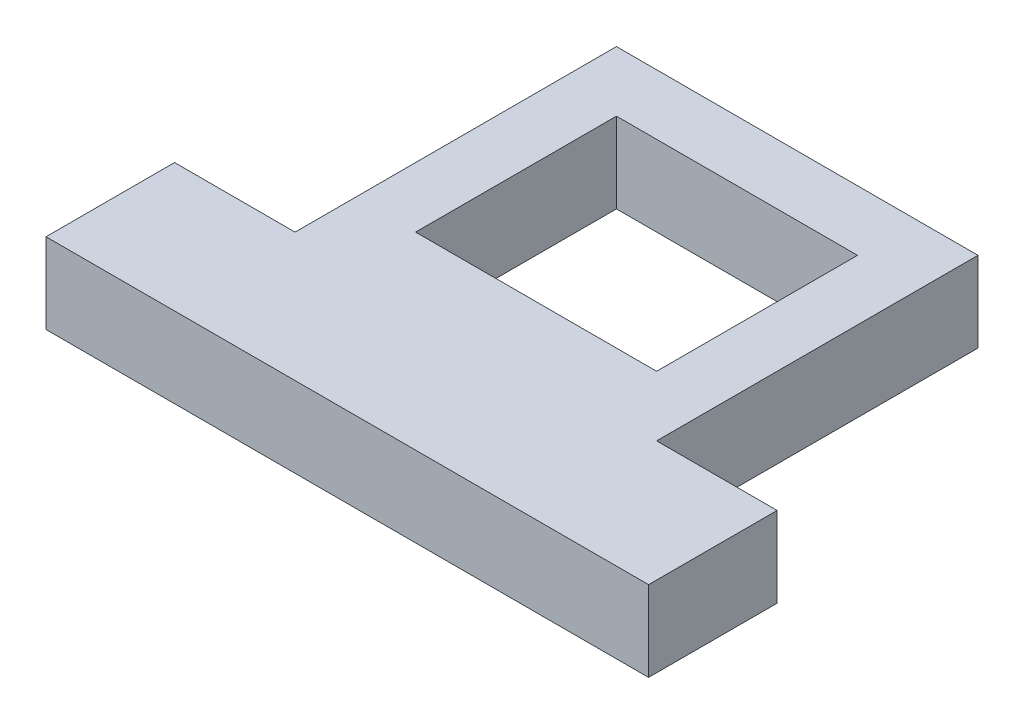
ISO-10303-21;
HEADER;
FILE_DESCRIPTION(('STEP AP214'),'2;1');
FILE_NAME('part.step','',(''),(''),'','','');
FILE_SCHEMA(('AUTOMOTIVE_DESIGN { 1 0 10303 214 1 1 1 1 }'));
ENDSEC;
DATA;
#1=APPLICATION_CONTEXT('core data for automotive mechanical design processes');
#2=APPLICATION_PROTOCOL_DEFINITION('international standard','automotive_design',2000,#1);
#3=PRODUCT_CONTEXT('',#1,'mechanical');
#4=PRODUCT('Part','Part','',(#3));
#5=PRODUCT_RELATED_PRODUCT_CATEGORY('part','',(#4));
#6=PRODUCT_DEFINITION_FORMATION('','',#4);
#7=PRODUCT_DEFINITION_CONTEXT('part definition',#1,'design');
#8=PRODUCT_DEFINITION('design','',#6,#7);
#9=PRODUCT_DEFINITION_SHAPE('','',#8);
#10=(LENGTH_UNIT() NAMED_UNIT(*) SI_UNIT(.MILLI.,.METRE.));
#11=(NAMED_UNIT(*) PLANE_ANGLE_UNIT() SI_UNIT($,.RADIAN.));
#12=(NAMED_UNIT(*) SI_UNIT($,.STERADIAN.) SOLID_ANGLE_UNIT());
#13=UNCERTAINTY_MEASURE_WITH_UNIT(LENGTH_MEASURE(1.E-05),#10,'distance_accuracy_value','');
#14=(GEOMETRIC_REPRESENTATION_CONTEXT(3) GLOBAL_UNCERTAINTY_ASSIGNED_CONTEXT((#13)) GLOBAL_UNIT_ASSIGNED_CONTEXT((#10,
#11,#12)) REPRESENTATION_CONTEXT('',''));
#15=CARTESIAN_POINT('',(0.,0.,0.));
#16=DIRECTION('',(0.,0.,1.));
#17=DIRECTION('',(1.,0.,0.));
#18=AXIS2_PLACEMENT_3D('',#15,#16,#17);
#19=CARTESIAN_POINT('',(0.,2.,0.));
#20=DIRECTION('',(0.,1.,0.));
#21=DIRECTION('',(0.,0.,1.));
#22=AXIS2_PLACEMENT_3D('',#19,#20,#21);
#23=PLANE('',#22);
#24=DIRECTION('',(0.,0.,1.));
#25=VECTOR('',#24,1.);
#26=CARTESIAN_POINT('',(-4.5,2.,-4.));
#27=LINE('',#26,#25);
#28=CARTESIAN_POINT('',(-4.5,2.,-4.));
#29=VERTEX_POINT('',#28);
#30=CARTESIAN_POINT('',(-4.5,2.,4.));
#31=VERTEX_POINT('',#30);
#32=EDGE_CURVE('E205',#29,#31,#27,.T.);
#33=ORIENTED_EDGE('',*,*,#32,.T.);
#34=DIRECTION('',(-1.,0.,0.));
#35=VECTOR('',#34,1.);
#36=CARTESIAN_POINT('',(7.5,2.,4.));
#37=LINE('',#36,#35);
#38=CARTESIAN_POINT('',(-7.5,2.,4.));
#39=VERTEX_POINT('',#38);
#40=EDGE_CURVE('E142',#31,#39,#37,.T.);
#41=ORIENTED_EDGE('',*,*,#40,.T.);
#42=DIRECTION('',(0.,0.,1.));
#43=VECTOR('',#42,1.);
#44=CARTESIAN_POINT('',(-7.5,2.,4.));
#45=LINE('',#44,#43);
#46=CARTESIAN_POINT('',(-7.5,2.,7.2));
#47=VERTEX_POINT('',#46);
#48=EDGE_CURVE('E141',#39,#47,#45,.T.);
#49=ORIENTED_EDGE('',*,*,#48,.T.);
#50=DIRECTION('',(1.,0.,0.));
#51=VECTOR('',#50,1.);
#52=CARTESIAN_POINT('',(7.5,2.,7.2));
#53=LINE('',#52,#51);
#54=CARTESIAN_POINT('',(7.5,2.,7.2));
#55=VERTEX_POINT('',#54);
#56=EDGE_CURVE('E148',#47,#55,#53,.T.);
#57=ORIENTED_EDGE('',*,*,#56,.T.);
#58=DIRECTION('',(0.,0.,-1.));
#59=VECTOR('',#58,1.);
#60=CARTESIAN_POINT('',(7.5,2.,4.));
#61=LINE('',#60,#59);
#62=CARTESIAN_POINT('',(7.5,2.,4.));
#63=VERTEX_POINT('',#62);
#64=EDGE_CURVE('E145',#55,#63,#61,.T.);
#65=ORIENTED_EDGE('',*,*,#64,.T.);
#66=CARTESIAN_POINT('',(4.5,2.,4.));
#67=VERTEX_POINT('',#66);
#68=EDGE_CURVE('E132',#63,#67,#37,.T.);
#69=ORIENTED_EDGE('',*,*,#68,.T.);
#70=DIRECTION('',(0.,0.,-1.));
#71=VECTOR('',#70,1.);
#72=CARTESIAN_POINT('',(4.5,2.,-4.));
#73=LINE('',#72,#71);
#74=CARTESIAN_POINT('',(4.5,2.,-4.));
#75=VERTEX_POINT('',#74);
#76=EDGE_CURVE('E208',#67,#75,#73,.T.);
#77=ORIENTED_EDGE('',*,*,#76,.T.);
#78=DIRECTION('',(-1.,0.,0.));
#79=VECTOR('',#78,1.);
#80=CARTESIAN_POINT('',(-4.5,2.,-4.));
#81=LINE('',#80,#79);
#82=EDGE_CURVE('E212',#75,#29,#81,.T.);
#83=ORIENTED_EDGE('',*,*,#82,.T.);
#84=EDGE_LOOP('',(#33,#41,#49,#57,#65,#69,#77,#83));
#85=FACE_BOUND('',#84,.T.);
#86=DIRECTION('',(-1.,0.,0.));
#87=VECTOR('',#86,1.);
#88=CARTESIAN_POINT('',(-3.,2.,-2.5));
#89=LINE('',#88,#87);
#90=CARTESIAN_POINT('',(3.,2.,-2.5));
#91=VERTEX_POINT('',#90);
#92=CARTESIAN_POINT('',(-3.,2.,-2.5));
#93=VERTEX_POINT('',#92);
#94=EDGE_CURVE('E173',#91,#93,#89,.T.);
#95=ORIENTED_EDGE('',*,*,#94,.F.);
#96=DIRECTION('',(0.,0.,-1.));
#97=VECTOR('',#96,1.);
#98=CARTESIAN_POINT('',(3.,2.,-2.5));
#99=LINE('',#98,#97);
#100=CARTESIAN_POINT('',(3.,2.,2.5));
#101=VERTEX_POINT('',#100);
#102=EDGE_CURVE('E170',#101,#91,#99,.T.);
#103=ORIENTED_EDGE('',*,*,#102,.F.);
#104=DIRECTION('',(1.,0.,0.));
#105=VECTOR('',#104,1.);
#106=CARTESIAN_POINT('',(-3.,2.,2.5));
#107=LINE('',#106,#105);
#108=CARTESIAN_POINT('',(-3.,2.,2.5));
#109=VERTEX_POINT('',#108);
#110=EDGE_CURVE('E180',#109,#101,#107,.T.);
#111=ORIENTED_EDGE('',*,*,#110,.F.);
#112=DIRECTION('',(0.,0.,1.));
#113=VECTOR('',#112,1.);
#114=CARTESIAN_POINT('',(-3.,2.,-2.5));
#115=LINE('',#114,#113);
#116=EDGE_CURVE('E177',#93,#109,#115,.T.);
#117=ORIENTED_EDGE('',*,*,#116,.F.);
#118=EDGE_LOOP('',(#95,#103,#111,#117));
#119=FACE_BOUND('',#118,.T.);
#120=ADVANCED_FACE('F39',(#85,#119),#23,.T.);
#121=CARTESIAN_POINT('',(0.,0.,0.));
#122=DIRECTION('',(0.,1.,0.));
#123=DIRECTION('',(0.,0.,1.));
#124=AXIS2_PLACEMENT_3D('',#121,#122,#123);
#125=PLANE('',#124);
#126=DIRECTION('',(0.,0.,1.));
#127=VECTOR('',#126,1.);
#128=CARTESIAN_POINT('',(-4.5,0.,-4.));
#129=LINE('',#128,#127);
#130=CARTESIAN_POINT('',(-4.5,0.,-4.));
#131=VERTEX_POINT('',#130);
#132=CARTESIAN_POINT('',(-4.5,0.,4.));
#133=VERTEX_POINT('',#132);
#134=EDGE_CURVE('E204',#131,#133,#129,.T.);
#135=ORIENTED_EDGE('',*,*,#134,.F.);
#136=DIRECTION('',(-1.,0.,0.));
#137=VECTOR('',#136,1.);
#138=CARTESIAN_POINT('',(-4.5,0.,-4.));
#139=LINE('',#138,#137);
#140=CARTESIAN_POINT('',(4.5,0.,-4.));
#141=VERTEX_POINT('',#140);
#142=EDGE_CURVE('E209',#141,#131,#139,.T.);
#143=ORIENTED_EDGE('',*,*,#142,.F.);
#144=DIRECTION('',(0.,0.,-1.));
#145=VECTOR('',#144,1.);
#146=CARTESIAN_POINT('',(4.5,0.,-4.));
#147=LINE('',#146,#145);
#148=CARTESIAN_POINT('',(4.5,0.,4.));
#149=VERTEX_POINT('',#148);
#150=EDGE_CURVE('E218',#149,#141,#147,.T.);
#151=ORIENTED_EDGE('',*,*,#150,.F.);
#152=DIRECTION('',(-1.,0.,0.));
#153=VECTOR('',#152,1.);
#154=CARTESIAN_POINT('',(7.5,0.,4.));
#155=LINE('',#154,#153);
#156=CARTESIAN_POINT('',(7.5,0.,4.));
#157=VERTEX_POINT('',#156);
#158=EDGE_CURVE('E239',#157,#149,#155,.T.);
#159=ORIENTED_EDGE('',*,*,#158,.F.);
#160=DIRECTION('',(0.,0.,-1.));
#161=VECTOR('',#160,1.);
#162=CARTESIAN_POINT('',(7.5,0.,4.));
#163=LINE('',#162,#161);
#164=CARTESIAN_POINT('',(7.5,0.,7.2));
#165=VERTEX_POINT('',#164);
#166=EDGE_CURVE('E157',#165,#157,#163,.T.);
#167=ORIENTED_EDGE('',*,*,#166,.F.);
#168=DIRECTION('',(1.,0.,0.));
#169=VECTOR('',#168,1.);
#170=CARTESIAN_POINT('',(7.5,0.,7.2));
#171=LINE('',#170,#169);
#172=CARTESIAN_POINT('',(-7.5,0.,7.2));
#173=VERTEX_POINT('',#172);
#174=EDGE_CURVE('E153',#173,#165,#171,.T.);
#175=ORIENTED_EDGE('',*,*,#174,.F.);
#176=DIRECTION('',(0.,0.,1.));
#177=VECTOR('',#176,1.);
#178=CARTESIAN_POINT('',(-7.5,0.,4.));
#179=LINE('',#178,#177);
#180=CARTESIAN_POINT('',(-7.5,0.,4.));
#181=VERTEX_POINT('',#180);
#182=EDGE_CURVE('E241',#181,#173,#179,.T.);
#183=ORIENTED_EDGE('',*,*,#182,.F.);
#184=EDGE_CURVE('E242',#133,#181,#155,.T.);
#185=ORIENTED_EDGE('',*,*,#184,.F.);
#186=EDGE_LOOP('',(#135,#143,#151,#159,#167,#175,#183,#185));
#187=FACE_BOUND('',#186,.T.);
#188=DIRECTION('',(0.,0.,-1.));
#189=VECTOR('',#188,1.);
#190=CARTESIAN_POINT('',(3.,0.,-2.5));
#191=LINE('',#190,#189);
#192=CARTESIAN_POINT('',(3.,0.,2.5));
#193=VERTEX_POINT('',#192);
#194=CARTESIAN_POINT('',(3.,0.,-2.5));
#195=VERTEX_POINT('',#194);
#196=EDGE_CURVE('E63',#193,#195,#191,.T.);
#197=ORIENTED_EDGE('',*,*,#196,.T.);
#198=DIRECTION('',(-1.,0.,0.));
#199=VECTOR('',#198,1.);
#200=CARTESIAN_POINT('',(-3.,0.,-2.5));
#201=LINE('',#200,#199);
#202=CARTESIAN_POINT('',(-3.,0.,-2.5));
#203=VERTEX_POINT('',#202);
#204=EDGE_CURVE('E163',#195,#203,#201,.T.);
#205=ORIENTED_EDGE('',*,*,#204,.T.);
#206=DIRECTION('',(0.,0.,1.));
#207=VECTOR('',#206,1.);
#208=CARTESIAN_POINT('',(-3.,0.,-2.5));
#209=LINE('',#208,#207);
#210=CARTESIAN_POINT('',(-3.,0.,2.5));
#211=VERTEX_POINT('',#210);
#212=EDGE_CURVE('E187',#203,#211,#209,.T.);
#213=ORIENTED_EDGE('',*,*,#212,.T.);
#214=DIRECTION('',(1.,0.,0.));
#215=VECTOR('',#214,1.);
#216=CARTESIAN_POINT('',(-3.,0.,2.5));
#217=LINE('',#216,#215);
#218=EDGE_CURVE('E174',#211,#193,#217,.T.);
#219=ORIENTED_EDGE('',*,*,#218,.T.);
#220=EDGE_LOOP('',(#197,#205,#213,#219));
#221=FACE_BOUND('',#220,.T.);
#222=ADVANCED_FACE('F237',(#187,#221),#125,.F.);
#223=CARTESIAN_POINT('',(-4.5,2.,-4.));
#224=DIRECTION('',(1.,0.,0.));
#225=DIRECTION('',(0.,0.,-1.));
#226=AXIS2_PLACEMENT_3D('',#223,#224,#225);
#227=PLANE('',#226);
#228=ORIENTED_EDGE('',*,*,#134,.T.);
#229=DIRECTION('',(0.,-1.,0.));
#230=VECTOR('',#229,1.);
#231=CARTESIAN_POINT('',(-4.5,2.,4.));
#232=LINE('',#231,#230);
#233=EDGE_CURVE('E11',#31,#133,#232,.T.);
#234=ORIENTED_EDGE('',*,*,#233,.F.);
#235=ORIENTED_EDGE('',*,*,#32,.F.);
#236=DIRECTION('',(0.,-1.,0.));
#237=VECTOR('',#236,1.);
#238=CARTESIAN_POINT('',(-4.5,2.,-4.));
#239=LINE('',#238,#237);
#240=EDGE_CURVE('E215',#29,#131,#239,.T.);
#241=ORIENTED_EDGE('',*,*,#240,.T.);
#242=EDGE_LOOP('',(#228,#234,#235,#241));
#243=FACE_BOUND('',#242,.T.);
#244=ADVANCED_FACE('F41',(#243),#227,.F.);
#245=CARTESIAN_POINT('',(4.5,2.,-4.));
#246=DIRECTION('',(-1.,0.,0.));
#247=DIRECTION('',(0.,0.,1.));
#248=AXIS2_PLACEMENT_3D('',#245,#246,#247);
#249=PLANE('',#248);
#250=ORIENTED_EDGE('',*,*,#150,.T.);
#251=DIRECTION('',(0.,-1.,0.));
#252=VECTOR('',#251,1.);
#253=CARTESIAN_POINT('',(4.5,2.,-4.));
#254=LINE('',#253,#252);
#255=EDGE_CURVE('E226',#75,#141,#254,.T.);
#256=ORIENTED_EDGE('',*,*,#255,.F.);
#257=ORIENTED_EDGE('',*,*,#76,.F.);
#258=DIRECTION('',(0.,-1.,0.));
#259=VECTOR('',#258,1.);
#260=CARTESIAN_POINT('',(4.5,2.,4.));
#261=LINE('',#260,#259);
#262=EDGE_CURVE('E48',#67,#149,#261,.T.);
#263=ORIENTED_EDGE('',*,*,#262,.T.);
#264=EDGE_LOOP('',(#250,#256,#257,#263));
#265=FACE_BOUND('',#264,.T.);
#266=ADVANCED_FACE('F232',(#265),#249,.F.);
#267=CARTESIAN_POINT('',(-4.5,2.,-4.));
#268=DIRECTION('',(0.,0.,1.));
#269=DIRECTION('',(1.,0.,0.));
#270=AXIS2_PLACEMENT_3D('',#267,#268,#269);
#271=PLANE('',#270);
#272=ORIENTED_EDGE('',*,*,#142,.T.);
#273=ORIENTED_EDGE('',*,*,#240,.F.);
#274=ORIENTED_EDGE('',*,*,#82,.F.);
#275=ORIENTED_EDGE('',*,*,#255,.T.);
#276=EDGE_LOOP('',(#272,#273,#274,#275));
#277=FACE_BOUND('',#276,.T.);
#278=ADVANCED_FACE('F276',(#277),#271,.F.);
#279=CARTESIAN_POINT('',(3.,2.,-2.5));
#280=DIRECTION('',(-1.,0.,0.));
#281=DIRECTION('',(0.,0.,1.));
#282=AXIS2_PLACEMENT_3D('',#279,#280,#281);
#283=PLANE('',#282);
#284=ORIENTED_EDGE('',*,*,#196,.F.);
#285=DIRECTION('',(0.,-1.,0.));
#286=VECTOR('',#285,1.);
#287=CARTESIAN_POINT('',(3.,2.,2.5));
#288=LINE('',#287,#286);
#289=EDGE_CURVE('E182',#101,#193,#288,.T.);
#290=ORIENTED_EDGE('',*,*,#289,.F.);
#291=ORIENTED_EDGE('',*,*,#102,.T.);
#292=DIRECTION('',(0.,-1.,0.));
#293=VECTOR('',#292,1.);
#294=CARTESIAN_POINT('',(3.,2.,-2.5));
#295=LINE('',#294,#293);
#296=EDGE_CURVE('E201',#91,#195,#295,.T.);
#297=ORIENTED_EDGE('',*,*,#296,.T.);
#298=EDGE_LOOP('',(#284,#290,#291,#297));
#299=FACE_BOUND('',#298,.T.);
#300=ADVANCED_FACE('F282',(#299),#283,.T.);
#301=CARTESIAN_POINT('',(-3.,2.,-2.5));
#302=DIRECTION('',(0.,0.,1.));
#303=DIRECTION('',(1.,0.,0.));
#304=AXIS2_PLACEMENT_3D('',#301,#302,#303);
#305=PLANE('',#304);
#306=ORIENTED_EDGE('',*,*,#204,.F.);
#307=ORIENTED_EDGE('',*,*,#296,.F.);
#308=ORIENTED_EDGE('',*,*,#94,.T.);
#309=DIRECTION('',(0.,-1.,0.));
#310=VECTOR('',#309,1.);
#311=CARTESIAN_POINT('',(-3.,2.,-2.5));
#312=LINE('',#311,#310);
#313=EDGE_CURVE('E198',#93,#203,#312,.T.);
#314=ORIENTED_EDGE('',*,*,#313,.T.);
#315=EDGE_LOOP('',(#306,#307,#308,#314));
#316=FACE_BOUND('',#315,.T.);
#317=ADVANCED_FACE('F288',(#316),#305,.T.);
#318=CARTESIAN_POINT('',(-3.,2.,-2.5));
#319=DIRECTION('',(1.,0.,0.));
#320=DIRECTION('',(0.,0.,-1.));
#321=AXIS2_PLACEMENT_3D('',#318,#319,#320);
#322=PLANE('',#321);
#323=ORIENTED_EDGE('',*,*,#212,.F.);
#324=ORIENTED_EDGE('',*,*,#313,.F.);
#325=ORIENTED_EDGE('',*,*,#116,.T.);
#326=DIRECTION('',(0.,-1.,0.));
#327=VECTOR('',#326,1.);
#328=CARTESIAN_POINT('',(-3.,2.,2.5));
#329=LINE('',#328,#327);
#330=EDGE_CURVE('E55',#109,#211,#329,.T.);
#331=ORIENTED_EDGE('',*,*,#330,.T.);
#332=EDGE_LOOP('',(#323,#324,#325,#331));
#333=FACE_BOUND('',#332,.T.);
#334=ADVANCED_FACE('F299',(#333),#322,.T.);
#335=CARTESIAN_POINT('',(-3.,2.,2.5));
#336=DIRECTION('',(0.,0.,-1.));
#337=DIRECTION('',(-1.,0.,0.));
#338=AXIS2_PLACEMENT_3D('',#335,#336,#337);
#339=PLANE('',#338);
#340=ORIENTED_EDGE('',*,*,#218,.F.);
#341=ORIENTED_EDGE('',*,*,#330,.F.);
#342=ORIENTED_EDGE('',*,*,#110,.T.);
#343=ORIENTED_EDGE('',*,*,#289,.T.);
#344=EDGE_LOOP('',(#340,#341,#342,#343));
#345=FACE_BOUND('',#344,.T.);
#346=ADVANCED_FACE('F303',(#345),#339,.T.);
#347=CARTESIAN_POINT('',(7.5,2.,4.));
#348=DIRECTION('',(0.,0.,1.));
#349=DIRECTION('',(1.,0.,0.));
#350=AXIS2_PLACEMENT_3D('',#347,#348,#349);
#351=PLANE('',#350);
#352=ORIENTED_EDGE('',*,*,#40,.F.);
#353=ORIENTED_EDGE('',*,*,#233,.T.);
#354=ORIENTED_EDGE('',*,*,#184,.T.);
#355=DIRECTION('',(0.,-1.,0.));
#356=VECTOR('',#355,1.);
#357=CARTESIAN_POINT('',(-7.5,2.,4.));
#358=LINE('',#357,#356);
#359=EDGE_CURVE('E159',#39,#181,#358,.T.);
#360=ORIENTED_EDGE('',*,*,#359,.F.);
#361=EDGE_LOOP('',(#352,#353,#354,#360));
#362=FACE_BOUND('',#361,.T.);
#363=ADVANCED_FACE('F269',(#362),#351,.F.);
#364=CARTESIAN_POINT('',(7.5,2.,4.));
#365=DIRECTION('',(-1.,0.,0.));
#366=DIRECTION('',(0.,0.,1.));
#367=AXIS2_PLACEMENT_3D('',#364,#365,#366);
#368=PLANE('',#367);
#369=ORIENTED_EDGE('',*,*,#166,.T.);
#370=DIRECTION('',(0.,-1.,0.));
#371=VECTOR('',#370,1.);
#372=CARTESIAN_POINT('',(7.5,2.,4.));
#373=LINE('',#372,#371);
#374=EDGE_CURVE('E137',#63,#157,#373,.T.);
#375=ORIENTED_EDGE('',*,*,#374,.F.);
#376=ORIENTED_EDGE('',*,*,#64,.F.);
#377=DIRECTION('',(0.,-1.,0.));
#378=VECTOR('',#377,1.);
#379=CARTESIAN_POINT('',(7.5,2.,7.2));
#380=LINE('',#379,#378);
#381=EDGE_CURVE('E252',#55,#165,#380,.T.);
#382=ORIENTED_EDGE('',*,*,#381,.T.);
#383=EDGE_LOOP('',(#369,#375,#376,#382));
#384=FACE_BOUND('',#383,.T.);
#385=ADVANCED_FACE('F155',(#384),#368,.F.);
#386=ORIENTED_EDGE('',*,*,#262,.F.);
#387=ORIENTED_EDGE('',*,*,#68,.F.);
#388=ORIENTED_EDGE('',*,*,#374,.T.);
#389=ORIENTED_EDGE('',*,*,#158,.T.);
#390=EDGE_LOOP('',(#386,#387,#388,#389));
#391=FACE_BOUND('',#390,.T.);
#392=ADVANCED_FACE('F134',(#391),#351,.F.);
#393=CARTESIAN_POINT('',(-7.5,2.,4.));
#394=DIRECTION('',(1.,0.,0.));
#395=DIRECTION('',(0.,0.,-1.));
#396=AXIS2_PLACEMENT_3D('',#393,#394,#395);
#397=PLANE('',#396);
#398=ORIENTED_EDGE('',*,*,#182,.T.);
#399=DIRECTION('',(0.,-1.,0.));
#400=VECTOR('',#399,1.);
#401=CARTESIAN_POINT('',(-7.5,2.,7.2));
#402=LINE('',#401,#400);
#403=EDGE_CURVE('E166',#47,#173,#402,.T.);
#404=ORIENTED_EDGE('',*,*,#403,.F.);
#405=ORIENTED_EDGE('',*,*,#48,.F.);
#406=ORIENTED_EDGE('',*,*,#359,.T.);
#407=EDGE_LOOP('',(#398,#404,#405,#406));
#408=FACE_BOUND('',#407,.T.);
#409=ADVANCED_FACE('F265',(#408),#397,.F.);
#410=CARTESIAN_POINT('',(7.5,2.,7.2));
#411=DIRECTION('',(0.,0.,-1.));
#412=DIRECTION('',(-1.,0.,0.));
#413=AXIS2_PLACEMENT_3D('',#410,#411,#412);
#414=PLANE('',#413);
#415=ORIENTED_EDGE('',*,*,#174,.T.);
#416=ORIENTED_EDGE('',*,*,#381,.F.);
#417=ORIENTED_EDGE('',*,*,#56,.F.);
#418=ORIENTED_EDGE('',*,*,#403,.T.);
#419=EDGE_LOOP('',(#415,#416,#417,#418));
#420=FACE_BOUND('',#419,.T.);
#421=ADVANCED_FACE('F259',(#420),#414,.F.);
#422=CLOSED_SHELL('',(#120,#222,#244,#266,#278,#300,#317,#334,#346,#363,#385,#392,#409,#421));
#423=MANIFOLD_SOLID_BREP('B2',#422);
#424=ADVANCED_BREP_SHAPE_REPRESENTATION('',(#18,#423),#14);
#425=SHAPE_DEFINITION_REPRESENTATION(#9,#424);
ENDSEC;
END-ISO-10303-21;
